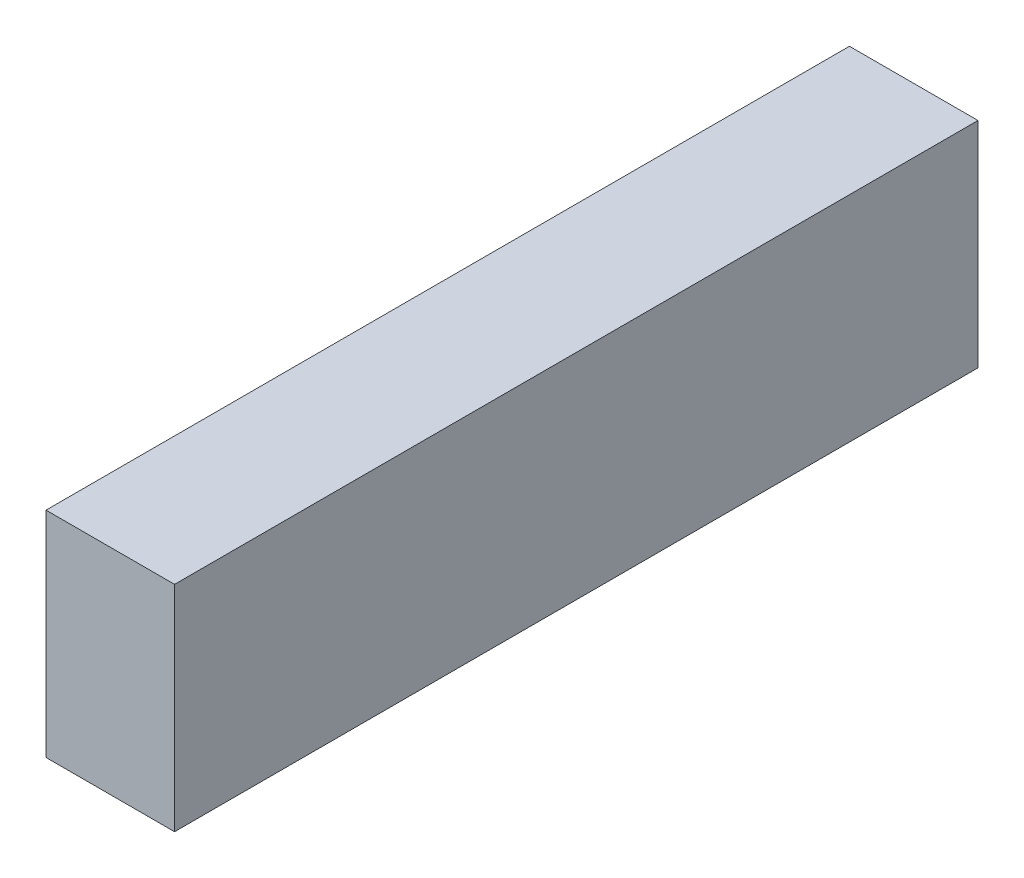
ISO-10303-21;
HEADER;
FILE_DESCRIPTION(('STEP AP214'),'2;1');
FILE_NAME('part.step','',(''),(''),'','','');
FILE_SCHEMA(('AUTOMOTIVE_DESIGN { 1 0 10303 214 1 1 1 1 }'));
ENDSEC;
DATA;
#1=APPLICATION_CONTEXT('core data for automotive mechanical design processes');
#2=APPLICATION_PROTOCOL_DEFINITION('international standard','automotive_design',2000,#1);
#3=PRODUCT_CONTEXT('',#1,'mechanical');
#4=PRODUCT('Part','Part','',(#3));
#5=PRODUCT_RELATED_PRODUCT_CATEGORY('part','',(#4));
#6=PRODUCT_DEFINITION_FORMATION('','',#4);
#7=PRODUCT_DEFINITION_CONTEXT('part definition',#1,'design');
#8=PRODUCT_DEFINITION('design','',#6,#7);
#9=PRODUCT_DEFINITION_SHAPE('','',#8);
#10=(LENGTH_UNIT() NAMED_UNIT(*) SI_UNIT(.MILLI.,.METRE.));
#11=(NAMED_UNIT(*) PLANE_ANGLE_UNIT() SI_UNIT($,.RADIAN.));
#12=(NAMED_UNIT(*) SI_UNIT($,.STERADIAN.) SOLID_ANGLE_UNIT());
#13=UNCERTAINTY_MEASURE_WITH_UNIT(LENGTH_MEASURE(1.E-05),#10,'distance_accuracy_value','');
#14=(GEOMETRIC_REPRESENTATION_CONTEXT(3) GLOBAL_UNCERTAINTY_ASSIGNED_CONTEXT((#13)) GLOBAL_UNIT_ASSIGNED_CONTEXT((#10,
#11,#12)) REPRESENTATION_CONTEXT('',''));
#15=CARTESIAN_POINT('',(0.,0.,0.));
#16=DIRECTION('',(0.,0.,1.));
#17=DIRECTION('',(1.,0.,0.));
#18=AXIS2_PLACEMENT_3D('',#15,#16,#17);
#19=CARTESIAN_POINT('',(6.00000000000001,-10.,75.));
#20=DIRECTION('',(-1.,0.,0.));
#21=DIRECTION('',(0.,0.,1.));
#22=AXIS2_PLACEMENT_3D('',#19,#20,#21);
#23=PLANE('',#22);
#24=DIRECTION('',(0.,1.,0.));
#25=VECTOR('',#24,1.);
#26=CARTESIAN_POINT('',(6.00000000000001,-10.,0.));
#27=LINE('',#26,#25);
#28=CARTESIAN_POINT('',(6.00000000000001,-10.,0.));
#29=VERTEX_POINT('',#28);
#30=CARTESIAN_POINT('',(6.00000000000001,10.,0.));
#31=VERTEX_POINT('',#30);
#32=EDGE_CURVE('E113',#29,#31,#27,.T.);
#33=ORIENTED_EDGE('',*,*,#32,.T.);
#34=DIRECTION('',(0.,0.,-1.));
#35=VECTOR('',#34,1.);
#36=CARTESIAN_POINT('',(6.00000000000001,10.,75.));
#37=LINE('',#36,#35);
#38=CARTESIAN_POINT('',(6.00000000000001,10.,75.));
#39=VERTEX_POINT('',#38);
#40=EDGE_CURVE('E11',#39,#31,#37,.T.);
#41=ORIENTED_EDGE('',*,*,#40,.F.);
#42=DIRECTION('',(0.,1.,0.));
#43=VECTOR('',#42,1.);
#44=CARTESIAN_POINT('',(6.00000000000001,-10.,75.));
#45=LINE('',#44,#43);
#46=CARTESIAN_POINT('',(6.00000000000001,-10.,75.));
#47=VERTEX_POINT('',#46);
#48=EDGE_CURVE('E97',#47,#39,#45,.T.);
#49=ORIENTED_EDGE('',*,*,#48,.F.);
#50=DIRECTION('',(0.,0.,-1.));
#51=VECTOR('',#50,1.);
#52=CARTESIAN_POINT('',(6.00000000000001,-10.,75.));
#53=LINE('',#52,#51);
#54=EDGE_CURVE('E109',#47,#29,#53,.T.);
#55=ORIENTED_EDGE('',*,*,#54,.T.);
#56=EDGE_LOOP('',(#33,#41,#49,#55));
#57=FACE_BOUND('',#56,.T.);
#58=ADVANCED_FACE('F45',(#57),#23,.F.);
#59=CARTESIAN_POINT('',(-5.99999999999999,10.,75.));
#60=DIRECTION('',(0.,-1.,0.));
#61=DIRECTION('',(0.,0.,-1.));
#62=AXIS2_PLACEMENT_3D('',#59,#60,#61);
#63=PLANE('',#62);
#64=DIRECTION('',(-1.,0.,0.));
#65=VECTOR('',#64,1.);
#66=CARTESIAN_POINT('',(-5.99999999999999,10.,0.));
#67=LINE('',#66,#65);
#68=CARTESIAN_POINT('',(-5.99999999999999,10.,0.));
#69=VERTEX_POINT('',#68);
#70=EDGE_CURVE('E102',#31,#69,#67,.T.);
#71=ORIENTED_EDGE('',*,*,#70,.T.);
#72=DIRECTION('',(0.,0.,-1.));
#73=VECTOR('',#72,1.);
#74=CARTESIAN_POINT('',(-5.99999999999999,10.,75.));
#75=LINE('',#74,#73);
#76=CARTESIAN_POINT('',(-5.99999999999999,10.,75.));
#77=VERTEX_POINT('',#76);
#78=EDGE_CURVE('E54',#77,#69,#75,.T.);
#79=ORIENTED_EDGE('',*,*,#78,.F.);
#80=DIRECTION('',(-1.,0.,0.));
#81=VECTOR('',#80,1.);
#82=CARTESIAN_POINT('',(-5.99999999999999,10.,75.));
#83=LINE('',#82,#81);
#84=EDGE_CURVE('E92',#39,#77,#83,.T.);
#85=ORIENTED_EDGE('',*,*,#84,.F.);
#86=ORIENTED_EDGE('',*,*,#40,.T.);
#87=EDGE_LOOP('',(#71,#79,#85,#86));
#88=FACE_BOUND('',#87,.T.);
#89=ADVANCED_FACE('F101',(#88),#63,.F.);
#90=CARTESIAN_POINT('',(-5.99999999999999,-10.,75.));
#91=DIRECTION('',(1.,0.,0.));
#92=DIRECTION('',(0.,0.,-1.));
#93=AXIS2_PLACEMENT_3D('',#90,#91,#92);
#94=PLANE('',#93);
#95=DIRECTION('',(0.,-1.,0.));
#96=VECTOR('',#95,1.);
#97=CARTESIAN_POINT('',(-5.99999999999999,-10.,0.));
#98=LINE('',#97,#96);
#99=CARTESIAN_POINT('',(-5.99999999999999,-10.,0.));
#100=VERTEX_POINT('',#99);
#101=EDGE_CURVE('E79',#69,#100,#98,.T.);
#102=ORIENTED_EDGE('',*,*,#101,.T.);
#103=DIRECTION('',(0.,0.,-1.));
#104=VECTOR('',#103,1.);
#105=CARTESIAN_POINT('',(-5.99999999999999,-10.,75.));
#106=LINE('',#105,#104);
#107=CARTESIAN_POINT('',(-5.99999999999999,-10.,75.));
#108=VERTEX_POINT('',#107);
#109=EDGE_CURVE('E104',#108,#100,#106,.T.);
#110=ORIENTED_EDGE('',*,*,#109,.F.);
#111=DIRECTION('',(0.,-1.,0.));
#112=VECTOR('',#111,1.);
#113=CARTESIAN_POINT('',(-5.99999999999999,-10.,75.));
#114=LINE('',#113,#112);
#115=EDGE_CURVE('E95',#77,#108,#114,.T.);
#116=ORIENTED_EDGE('',*,*,#115,.F.);
#117=ORIENTED_EDGE('',*,*,#78,.T.);
#118=EDGE_LOOP('',(#102,#110,#116,#117));
#119=FACE_BOUND('',#118,.T.);
#120=ADVANCED_FACE('F105',(#119),#94,.F.);
#121=CARTESIAN_POINT('',(-5.99999999999999,-10.,75.));
#122=DIRECTION('',(0.,1.,0.));
#123=DIRECTION('',(0.,0.,1.));
#124=AXIS2_PLACEMENT_3D('',#121,#122,#123);
#125=PLANE('',#124);
#126=DIRECTION('',(1.,0.,0.));
#127=VECTOR('',#126,1.);
#128=CARTESIAN_POINT('',(-5.99999999999999,-10.,0.));
#129=LINE('',#128,#127);
#130=EDGE_CURVE('E85',#100,#29,#129,.T.);
#131=ORIENTED_EDGE('',*,*,#130,.T.);
#132=ORIENTED_EDGE('',*,*,#54,.F.);
#133=DIRECTION('',(1.,0.,0.));
#134=VECTOR('',#133,1.);
#135=CARTESIAN_POINT('',(-5.99999999999999,-10.,75.));
#136=LINE('',#135,#134);
#137=EDGE_CURVE('E62',#108,#47,#136,.T.);
#138=ORIENTED_EDGE('',*,*,#137,.F.);
#139=ORIENTED_EDGE('',*,*,#109,.T.);
#140=EDGE_LOOP('',(#131,#132,#138,#139));
#141=FACE_BOUND('',#140,.T.);
#142=ADVANCED_FACE('F126',(#141),#125,.F.);
#143=CARTESIAN_POINT('',(0.,0.,75.));
#144=DIRECTION('',(0.,0.,-1.));
#145=DIRECTION('',(-1.,0.,0.));
#146=AXIS2_PLACEMENT_3D('',#143,#144,#145);
#147=PLANE('',#146);
#148=ORIENTED_EDGE('',*,*,#48,.T.);
#149=ORIENTED_EDGE('',*,*,#84,.T.);
#150=ORIENTED_EDGE('',*,*,#115,.T.);
#151=ORIENTED_EDGE('',*,*,#137,.T.);
#152=EDGE_LOOP('',(#148,#149,#150,#151));
#153=FACE_BOUND('',#152,.T.);
#154=ADVANCED_FACE('F93',(#153),#147,.F.);
#155=CARTESIAN_POINT('',(0.,0.,0.));
#156=DIRECTION('',(0.,0.,-1.));
#157=DIRECTION('',(-1.,0.,0.));
#158=AXIS2_PLACEMENT_3D('',#155,#156,#157);
#159=PLANE('',#158);
#160=ORIENTED_EDGE('',*,*,#32,.F.);
#161=ORIENTED_EDGE('',*,*,#130,.F.);
#162=ORIENTED_EDGE('',*,*,#101,.F.);
#163=ORIENTED_EDGE('',*,*,#70,.F.);
#164=EDGE_LOOP('',(#160,#161,#162,#163));
#165=FACE_BOUND('',#164,.T.);
#166=ADVANCED_FACE('F129',(#165),#159,.T.);
#167=CLOSED_SHELL('',(#58,#89,#120,#142,#154,#166));
#168=MANIFOLD_SOLID_BREP('B2',#167);
#169=ADVANCED_BREP_SHAPE_REPRESENTATION('',(#18,#168),#14);
#170=SHAPE_DEFINITION_REPRESENTATION(#9,#169);
ENDSEC;
END-ISO-10303-21;
